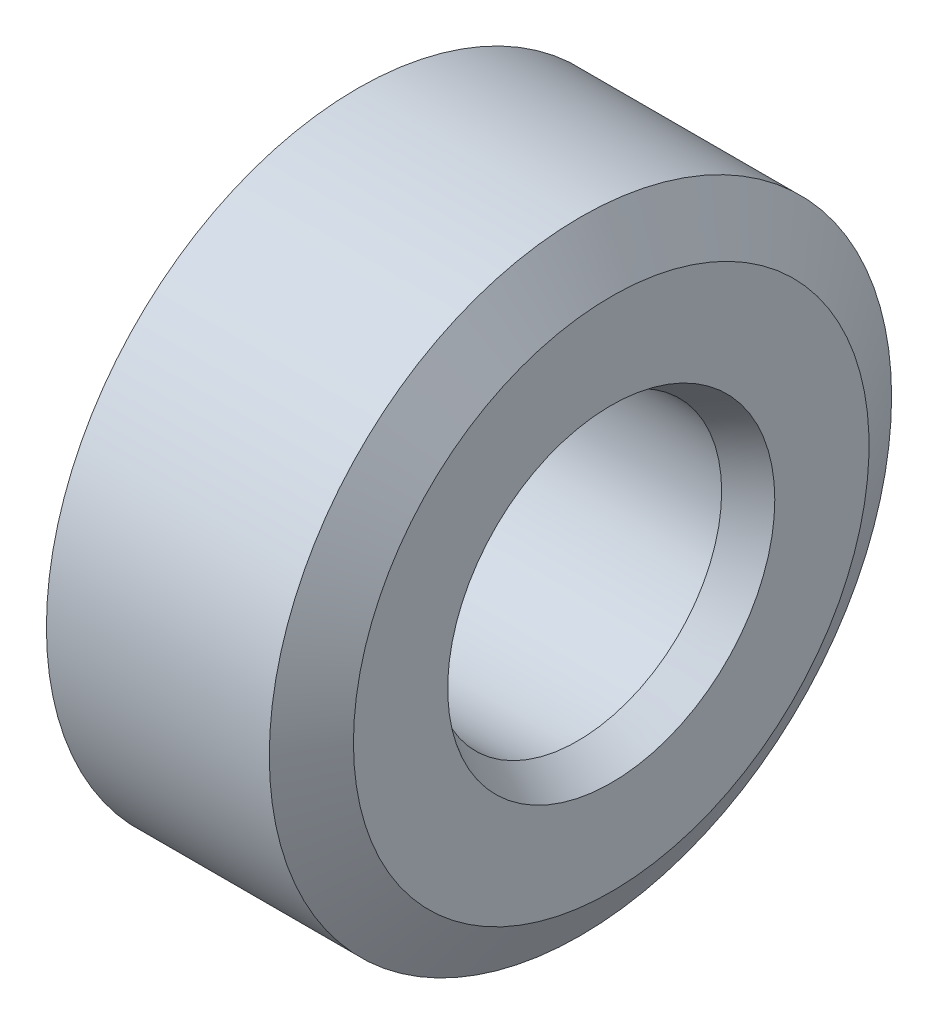
ISO-10303-21;
HEADER;
FILE_DESCRIPTION(('STEP AP214'),'2;1');
FILE_NAME('part.step','',(''),(''),'','','');
FILE_SCHEMA(('AUTOMOTIVE_DESIGN { 1 0 10303 214 1 1 1 1 }'));
ENDSEC;
DATA;
#1=APPLICATION_CONTEXT('core data for automotive mechanical design processes');
#2=APPLICATION_PROTOCOL_DEFINITION('international standard','automotive_design',2000,#1);
#3=PRODUCT_CONTEXT('',#1,'mechanical');
#4=PRODUCT('Part','Part','',(#3));
#5=PRODUCT_RELATED_PRODUCT_CATEGORY('part','',(#4));
#6=PRODUCT_DEFINITION_FORMATION('','',#4);
#7=PRODUCT_DEFINITION_CONTEXT('part definition',#1,'design');
#8=PRODUCT_DEFINITION('design','',#6,#7);
#9=PRODUCT_DEFINITION_SHAPE('','',#8);
#10=(LENGTH_UNIT() NAMED_UNIT(*) SI_UNIT(.MILLI.,.METRE.));
#11=(NAMED_UNIT(*) PLANE_ANGLE_UNIT() SI_UNIT($,.RADIAN.));
#12=(NAMED_UNIT(*) SI_UNIT($,.STERADIAN.) SOLID_ANGLE_UNIT());
#13=UNCERTAINTY_MEASURE_WITH_UNIT(LENGTH_MEASURE(1.E-05),#10,'distance_accuracy_value','');
#14=(GEOMETRIC_REPRESENTATION_CONTEXT(3) GLOBAL_UNCERTAINTY_ASSIGNED_CONTEXT((#13)) GLOBAL_UNIT_ASSIGNED_CONTEXT((#10,
#11,#12)) REPRESENTATION_CONTEXT('',''));
#15=CARTESIAN_POINT('',(0.,0.,0.));
#16=DIRECTION('',(0.,0.,1.));
#17=DIRECTION('',(1.,0.,0.));
#18=AXIS2_PLACEMENT_3D('',#15,#16,#17);
#19=CARTESIAN_POINT('',(1.60000000000841,0.,0.));
#20=DIRECTION('',(-1.,0.,0.));
#21=DIRECTION('',(0.,0.,1.));
#22=AXIS2_PLACEMENT_3D('',#19,#20,#21);
#23=CONICAL_SURFACE('',#22,5.67128129210665,1.0471975511966);
#24=CARTESIAN_POINT('',(2.85359208714381,0.,0.));
#25=DIRECTION('',(1.,0.,0.));
#26=DIRECTION('',(0.,0.,-1.));
#27=AXIS2_PLACEMENT_3D('',#24,#25,#26);
#28=CIRCLE('',#27,3.49999610522182);
#29=CARTESIAN_POINT('',(2.85359208714381,0.,-3.49999610522182));
#30=VERTEX_POINT('',#29);
#31=EDGE_CURVE('E10',#30,#30,#28,.T.);
#32=ORIENTED_EDGE('',*,*,#31,.T.);
#33=EDGE_LOOP('',(#32));
#34=FACE_BOUND('',#33,.T.);
#35=CARTESIAN_POINT('',(3.2,0.,0.));
#36=DIRECTION('',(-1.,0.,0.));
#37=DIRECTION('',(0.,0.,1.));
#38=AXIS2_PLACEMENT_3D('',#35,#36,#37);
#39=CIRCLE('',#38,2.900000000011);
#40=CARTESIAN_POINT('',(3.2,0.,2.900000000011));
#41=VERTEX_POINT('',#40);
#42=EDGE_CURVE('E57',#41,#41,#39,.T.);
#43=ORIENTED_EDGE('',*,*,#42,.T.);
#44=EDGE_LOOP('',(#43));
#45=FACE_BOUND('',#44,.T.);
#46=ADVANCED_FACE('F31',(#34,#45),#23,.T.);
#47=CARTESIAN_POINT('',(3.2,2.900000000011,0.));
#48=DIRECTION('',(1.,0.,0.));
#49=DIRECTION('',(0.,0.,-1.));
#50=AXIS2_PLACEMENT_3D('',#47,#48,#49);
#51=PLANE('',#50);
#52=CARTESIAN_POINT('',(3.2,0.,0.));
#53=DIRECTION('',(1.,0.,0.));
#54=DIRECTION('',(0.,0.,-1.));
#55=AXIS2_PLACEMENT_3D('',#52,#53,#54);
#56=CIRCLE('',#55,1.839749999969);
#57=CARTESIAN_POINT('',(3.2,0.,-1.839749999969));
#58=VERTEX_POINT('',#57);
#59=EDGE_CURVE('E54',#58,#58,#56,.F.);
#60=ORIENTED_EDGE('',*,*,#59,.T.);
#61=EDGE_LOOP('',(#60));
#62=FACE_BOUND('',#61,.T.);
#63=ORIENTED_EDGE('',*,*,#42,.F.);
#64=EDGE_LOOP('',(#63));
#65=FACE_BOUND('',#64,.T.);
#66=ADVANCED_FACE('F77',(#62,#65),#51,.T.);
#67=CARTESIAN_POINT('',(1.68180599444513E-11,0.,0.));
#68=DIRECTION('',(-1.,0.,0.));
#69=DIRECTION('',(0.,0.,1.));
#70=AXIS2_PLACEMENT_3D('',#67,#68,#69);
#71=PLANE('',#70);
#72=CARTESIAN_POINT('',(1.68180599444513E-11,0.,0.));
#73=DIRECTION('',(-1.,0.,0.));
#74=DIRECTION('',(0.,0.,1.));
#75=AXIS2_PLACEMENT_3D('',#72,#73,#74);
#76=CIRCLE('',#75,1.99988611408614);
#77=CARTESIAN_POINT('',(1.68180356793779E-11,0.,1.99988611408614));
#78=VERTEX_POINT('',#77);
#79=EDGE_CURVE('E42',#78,#78,#76,.F.);
#80=ORIENTED_EDGE('',*,*,#79,.T.);
#81=EDGE_LOOP('',(#80));
#82=FACE_BOUND('',#81,.T.);
#83=CARTESIAN_POINT('',(1.68181440995951E-11,0.,0.));
#84=DIRECTION('',(-1.,0.,0.));
#85=DIRECTION('',(0.,0.,1.));
#86=AXIS2_PLACEMENT_3D('',#83,#84,#85);
#87=CIRCLE('',#86,2.900000000011);
#88=CARTESIAN_POINT('',(1.68181440995951E-11,0.,2.900000000011));
#89=VERTEX_POINT('',#88);
#90=EDGE_CURVE('E60',#89,#89,#87,.T.);
#91=ORIENTED_EDGE('',*,*,#90,.T.);
#92=EDGE_LOOP('',(#91));
#93=FACE_BOUND('',#92,.T.);
#94=ADVANCED_FACE('F64',(#82,#93),#71,.T.);
#95=CARTESIAN_POINT('',(1.68181440995951E-11,0.,0.));
#96=DIRECTION('',(1.,0.,0.));
#97=DIRECTION('',(0.,0.,-1.));
#98=AXIS2_PLACEMENT_3D('',#95,#96,#97);
#99=CONICAL_SURFACE('',#98,2.900000000011,1.0471975511966);
#100=CARTESIAN_POINT('',(0.346407912873011,0.,0.));
#101=DIRECTION('',(-1.,0.,0.));
#102=DIRECTION('',(0.,0.,1.));
#103=AXIS2_PLACEMENT_3D('',#100,#101,#102);
#104=CIRCLE('',#103,3.49999610522182);
#105=CARTESIAN_POINT('',(0.346407912873011,0.,3.49999610522182));
#106=VERTEX_POINT('',#105);
#107=EDGE_CURVE('E38',#106,#106,#104,.T.);
#108=ORIENTED_EDGE('',*,*,#107,.T.);
#109=EDGE_LOOP('',(#108));
#110=FACE_BOUND('',#109,.T.);
#111=ORIENTED_EDGE('',*,*,#90,.F.);
#112=EDGE_LOOP('',(#111));
#113=FACE_BOUND('',#112,.T.);
#114=ADVANCED_FACE('F66',(#110,#113),#99,.T.);
#115=CARTESIAN_POINT('',(0.,0.,0.));
#116=DIRECTION('',(-1.,0.,0.));
#117=DIRECTION('',(0.,0.,1.));
#118=AXIS2_PLACEMENT_3D('',#115,#116,#117);
#119=CYLINDRICAL_SURFACE('',#118,1.62099999999999);
#120=CARTESIAN_POINT('',(2.82111388588472,0.,0.));
#121=DIRECTION('',(1.,0.,0.));
#122=DIRECTION('',(0.,0.,-1.));
#123=AXIS2_PLACEMENT_3D('',#120,#121,#122);
#124=CIRCLE('',#123,1.62099999999999);
#125=CARTESIAN_POINT('',(2.82111388588472,0.,-1.62099999999999));
#126=VERTEX_POINT('',#125);
#127=EDGE_CURVE('E46',#126,#126,#124,.T.);
#128=ORIENTED_EDGE('',*,*,#127,.T.);
#129=EDGE_LOOP('',(#128));
#130=FACE_BOUND('',#129,.T.);
#131=CARTESIAN_POINT('',(0.218749999969002,0.,0.));
#132=DIRECTION('',(-1.,0.,0.));
#133=DIRECTION('',(0.,0.,1.));
#134=AXIS2_PLACEMENT_3D('',#131,#132,#133);
#135=CIRCLE('',#134,1.62099999999999);
#136=CARTESIAN_POINT('',(0.218749999969002,0.,1.62099999999999));
#137=VERTEX_POINT('',#136);
#138=EDGE_CURVE('E51',#137,#137,#135,.T.);
#139=ORIENTED_EDGE('',*,*,#138,.T.);
#140=EDGE_LOOP('',(#139));
#141=FACE_BOUND('',#140,.T.);
#142=ADVANCED_FACE('F68',(#130,#141),#119,.F.);
#143=CARTESIAN_POINT('',(3.2,0.,0.));
#144=DIRECTION('',(1.,0.,0.));
#145=DIRECTION('',(0.,0.,-1.));
#146=AXIS2_PLACEMENT_3D('',#143,#144,#145);
#147=CONICAL_SURFACE('',#146,1.839749999969,0.523598775583131);
#148=ORIENTED_EDGE('',*,*,#127,.F.);
#149=EDGE_LOOP('',(#148));
#150=FACE_BOUND('',#149,.T.);
#151=ORIENTED_EDGE('',*,*,#59,.F.);
#152=EDGE_LOOP('',(#151));
#153=FACE_BOUND('',#152,.T.);
#154=ADVANCED_FACE('F74',(#150,#153),#147,.F.);
#155=CARTESIAN_POINT('',(0.218749999969002,0.,0.));
#156=DIRECTION('',(-1.,0.,0.));
#157=DIRECTION('',(0.,0.,1.));
#158=AXIS2_PLACEMENT_3D('',#155,#156,#157);
#159=CONICAL_SURFACE('',#158,1.62099999999999,1.04719755121177);
#160=CARTESIAN_POINT('',(1.68180356793779E-11,0.,1.99988611408614));
#161=CARTESIAN_POINT('',(0.00227864584965338,0.,1.99593938373107));
#162=CARTESIAN_POINT('',(0.0045572916824886,0.,1.99199265337601));
#163=CARTESIAN_POINT('',(0.00911458334815905,0.,1.98409919266588));
#164=CARTESIAN_POINT('',(0.0113932291809943,0.,1.98015246231082));
#165=CARTESIAN_POINT('',(0.0159505208466648,0.,1.97225900160069));
#166=CARTESIAN_POINT('',(0.0182291666795001,0.,1.96831227124563));
#167=CARTESIAN_POINT('',(0.0227864583451706,0.,1.9604188105355));
#168=CARTESIAN_POINT('',(0.0250651041780058,0.,1.95647208018043));
#169=CARTESIAN_POINT('',(0.0296223958436763,0.,1.94857861947031));
#170=CARTESIAN_POINT('',(0.0319010416765116,0.,1.94463188911524));
#171=CARTESIAN_POINT('',(0.0364583333421821,0.,1.93673842840511));
#172=CARTESIAN_POINT('',(0.0387369791750173,0.,1.93279169805005));
#173=CARTESIAN_POINT('',(0.0432942708406878,0.,1.92489823733992));
#174=CARTESIAN_POINT('',(0.0455729166735231,0.,1.92095150698486));
#175=CARTESIAN_POINT('',(0.0501302083391936,0.,1.91305804627473));
#176=CARTESIAN_POINT('',(0.0524088541720289,0.,1.90911131591967));
#177=CARTESIAN_POINT('',(0.0569661458376994,0.,1.90121785520954));
#178=CARTESIAN_POINT('',(0.0592447916705346,0.,1.89727112485447));
#179=CARTESIAN_POINT('',(0.0638020833362051,0.,1.88937766414435));
#180=CARTESIAN_POINT('',(0.0660807291690404,0.,1.88543093378928));
#181=CARTESIAN_POINT('',(0.0706380208347109,0.,1.87753747307915));
#182=CARTESIAN_POINT('',(0.0729166666675461,0.,1.87359074272409));
#183=CARTESIAN_POINT('',(0.0774739583332166,0.,1.86569728201396));
#184=CARTESIAN_POINT('',(0.0797526041660519,0.,1.8617505516589));
#185=CARTESIAN_POINT('',(0.0843098958317224,0.,1.85385709094877));
#186=CARTESIAN_POINT('',(0.0865885416645577,0.,1.84991036059371));
#187=CARTESIAN_POINT('',(0.0911458333302281,0.,1.84201689988358));
#188=CARTESIAN_POINT('',(0.0934244791630634,0.,1.83807016952851));
#189=CARTESIAN_POINT('',(0.0979817708287339,0.,1.83017670881839));
#190=CARTESIAN_POINT('',(0.100260416661569,0.,1.82622997846332));
#191=CARTESIAN_POINT('',(0.10481770832724,0.,1.81833651775319));
#192=CARTESIAN_POINT('',(0.107096354160075,0.,1.81438978739813));
#193=CARTESIAN_POINT('',(0.111653645825745,0.,1.806496326688));
#194=CARTESIAN_POINT('',(0.113932291658581,0.,1.80254959633294));
#195=CARTESIAN_POINT('',(0.118489583324251,0.,1.79465613562281));
#196=CARTESIAN_POINT('',(0.120768229157086,0.,1.79070940526775));
#197=CARTESIAN_POINT('',(0.125325520822757,0.,1.78281594455762));
#198=CARTESIAN_POINT('',(0.127604166655592,0.,1.77886921420255));
#199=CARTESIAN_POINT('',(0.132161458321263,0.,1.77097575349243));
#200=CARTESIAN_POINT('',(0.134440104154098,0.,1.76702902313736));
#201=CARTESIAN_POINT('',(0.138997395819768,0.,1.75913556242723));
#202=CARTESIAN_POINT('',(0.141276041652604,0.,1.75518883207217));
#203=CARTESIAN_POINT('',(0.145833333318274,0.,1.74729537136204));
#204=CARTESIAN_POINT('',(0.148111979151109,0.,1.74334864100698));
#205=CARTESIAN_POINT('',(0.15266927081678,0.,1.73545518029685));
#206=CARTESIAN_POINT('',(0.154947916649615,0.,1.73150844994179));
#207=CARTESIAN_POINT('',(0.159505208315286,0.,1.72361498923166));
#208=CARTESIAN_POINT('',(0.161783854148121,0.,1.71966825887659));
#209=CARTESIAN_POINT('',(0.166341145813791,0.,1.71177479816647));
#210=CARTESIAN_POINT('',(0.168619791646627,0.,1.7078280678114));
#211=CARTESIAN_POINT('',(0.173177083312297,0.,1.69993460710127));
#212=CARTESIAN_POINT('',(0.175455729145132,0.,1.69598787674621));
#213=CARTESIAN_POINT('',(0.180013020810803,0.,1.68809441603608));
#214=CARTESIAN_POINT('',(0.182291666643638,0.,1.68414768568102));
#215=CARTESIAN_POINT('',(0.186848958309309,0.,1.67625422497089));
#216=CARTESIAN_POINT('',(0.189127604142144,0.,1.67230749461583));
#217=CARTESIAN_POINT('',(0.193684895807814,0.,1.6644140339057));
#218=CARTESIAN_POINT('',(0.19596354164065,0.,1.66046730355063));
#219=CARTESIAN_POINT('',(0.20052083330632,0.,1.65257384284051));
#220=CARTESIAN_POINT('',(0.202799479139155,0.,1.64862711248544));
#221=CARTESIAN_POINT('',(0.207356770804826,0.,1.64073365177531));
#222=CARTESIAN_POINT('',(0.209635416637661,0.,1.63678692142025));
#223=CARTESIAN_POINT('',(0.214192708303332,0.,1.62889346071012));
#224=CARTESIAN_POINT('',(0.216471354136167,0.,1.62494673035506));
#225=CARTESIAN_POINT('',(0.218749999969002,0.,1.62099999999999));
#226=B_SPLINE_CURVE_WITH_KNOTS('',3,(#160,#161,#162,#163,#164,#165,#166,#167,#168,#169,#170,
#171,#172,#173,#174,#175,#176,#177,#178,#179,#180,#181,#182,#183,#184,#185,#186,#187,#188,#189,
#190,#191,#192,#193,#194,#195,#196,#197,#198,#199,#200,#201,#202,#203,#204,#205,#206,#207,#208,
#209,#210,#211,#212,#213,#214,#215,#216,#217,#218,#219,#220,#221,#222,#223,#224,#225),
.UNSPECIFIED.,.F.,.F.,(4,2,2,2,2,2,2,2,2,2,2,2,2,2,2,2,2,2,2,2,2,2,2,2,2,2,2,2,2,2,2,2,4),(0.,
0.0136718749973705,0.0273437499947414,0.041015624992112,0.0546874999894827,0.0683593749868534,
0.0820312499842241,0.0957031249815948,0.109374999978966,0.123046874976336,0.136718749973707,
0.150390624971078,0.164062499968448,0.177734374965819,0.19140624996319,0.20507812496056,
0.218749999957931,0.232421874955302,0.246093749952672,0.259765624950043,0.273437499947414,
0.287109374944784,0.300781249942155,0.314453124939526,0.328124999936897,0.341796874934267,
0.355468749931638,0.369140624929009,0.382812499926379,0.39648437492375,0.410156249921121,
0.423828124918491,0.437499999915862),.UNSPECIFIED.);
#227=EDGE_CURVE('BSEAM90',#78,#137,#226,.T.);
#228=ORIENTED_EDGE('',*,*,#79,.F.);
#229=ORIENTED_EDGE('',*,*,#138,.F.);
#230=ORIENTED_EDGE('',*,*,#227,.T.);
#231=ORIENTED_EDGE('',*,*,#227,.F.);
#232=EDGE_LOOP('',(#228,#230,#229,#231));
#233=FACE_BOUND('',#232,.T.);
#234=ADVANCED_FACE('F90',(#233),#159,.F.);
#235=CARTESIAN_POINT('',(0.346407912873011,0.,0.));
#236=DIRECTION('',(-1.,0.,0.));
#237=DIRECTION('',(0.,0.,1.));
#238=AXIS2_PLACEMENT_3D('',#235,#236,#237);
#239=CYLINDRICAL_SURFACE('',#238,3.49999610522182);
#240=ORIENTED_EDGE('',*,*,#31,.F.);
#241=EDGE_LOOP('',(#240));
#242=FACE_BOUND('',#241,.T.);
#243=ORIENTED_EDGE('',*,*,#107,.F.);
#244=EDGE_LOOP('',(#243));
#245=FACE_BOUND('',#244,.T.);
#246=ADVANCED_FACE('F33',(#242,#245),#239,.T.);
#247=CLOSED_SHELL('',(#46,#66,#94,#114,#142,#154,#234,#246));
#248=MANIFOLD_SOLID_BREP('B2',#247);
#249=ADVANCED_BREP_SHAPE_REPRESENTATION('',(#18,#248),#14);
#250=SHAPE_DEFINITION_REPRESENTATION(#9,#249);
ENDSEC;
END-ISO-10303-21;
